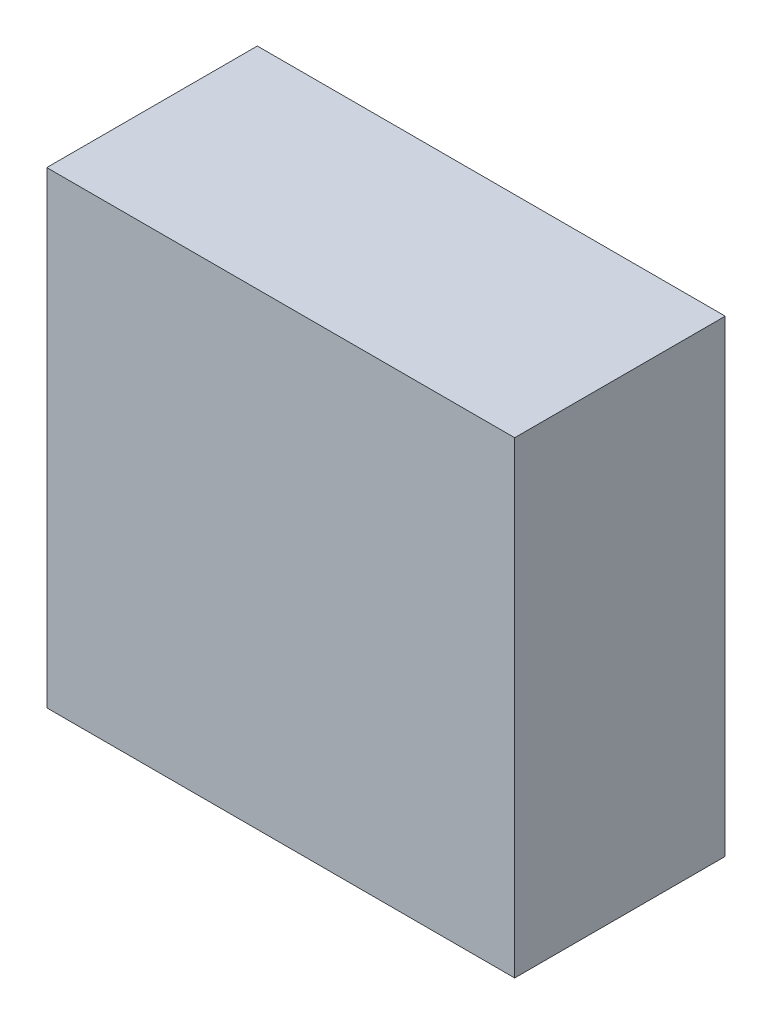
ISO-10303-21;
HEADER;
FILE_DESCRIPTION(('STEP AP214'),'2;1');
FILE_NAME('part.step','',(''),(''),'','','');
FILE_SCHEMA(('AUTOMOTIVE_DESIGN { 1 0 10303 214 1 1 1 1 }'));
ENDSEC;
DATA;
#1=APPLICATION_CONTEXT('core data for automotive mechanical design processes');
#2=APPLICATION_PROTOCOL_DEFINITION('international standard','automotive_design',2000,#1);
#3=PRODUCT_CONTEXT('',#1,'mechanical');
#4=PRODUCT('Part','Part','',(#3));
#5=PRODUCT_RELATED_PRODUCT_CATEGORY('part','',(#4));
#6=PRODUCT_DEFINITION_FORMATION('','',#4);
#7=PRODUCT_DEFINITION_CONTEXT('part definition',#1,'design');
#8=PRODUCT_DEFINITION('design','',#6,#7);
#9=PRODUCT_DEFINITION_SHAPE('','',#8);
#10=(LENGTH_UNIT() NAMED_UNIT(*) SI_UNIT(.MILLI.,.METRE.));
#11=(NAMED_UNIT(*) PLANE_ANGLE_UNIT() SI_UNIT($,.RADIAN.));
#12=(NAMED_UNIT(*) SI_UNIT($,.STERADIAN.) SOLID_ANGLE_UNIT());
#13=UNCERTAINTY_MEASURE_WITH_UNIT(LENGTH_MEASURE(1.E-05),#10,'distance_accuracy_value','');
#14=(GEOMETRIC_REPRESENTATION_CONTEXT(3) GLOBAL_UNCERTAINTY_ASSIGNED_CONTEXT((#13)) GLOBAL_UNIT_ASSIGNED_CONTEXT((#10,
#11,#12)) REPRESENTATION_CONTEXT('',''));
#15=CARTESIAN_POINT('',(0.,0.,0.));
#16=DIRECTION('',(0.,0.,1.));
#17=DIRECTION('',(1.,0.,0.));
#18=AXIS2_PLACEMENT_3D('',#15,#16,#17);
#19=CARTESIAN_POINT('',(1184.5,970.,-1050.));
#20=DIRECTION('',(0.,1.,0.));
#21=DIRECTION('',(1.,0.,0.));
#22=AXIS2_PLACEMENT_3D('',#19,#20,#21);
#23=PLANE('',#22);
#24=DIRECTION('',(0.,0.,1.));
#25=VECTOR('',#24,1.);
#26=CARTESIAN_POINT('',(1124.5,970.,-1050.));
#27=LINE('',#26,#25);
#28=CARTESIAN_POINT('',(1124.5,970.,-1047.));
#29=VERTEX_POINT('',#28);
#30=CARTESIAN_POINT('',(1124.5,970.,-1020.));
#31=VERTEX_POINT('',#30);
#32=EDGE_CURVE('E66',#29,#31,#27,.T.);
#33=ORIENTED_EDGE('',*,*,#32,.F.);
#34=DIRECTION('',(1.,0.,0.));
#35=VECTOR('',#34,1.);
#36=CARTESIAN_POINT('',(1184.5,970.,-1047.));
#37=LINE('',#36,#35);
#38=CARTESIAN_POINT('',(1184.5,970.,-1047.));
#39=VERTEX_POINT('',#38);
#40=EDGE_CURVE('E11',#29,#39,#37,.T.);
#41=ORIENTED_EDGE('',*,*,#40,.T.);
#42=DIRECTION('',(0.,0.,1.));
#43=VECTOR('',#42,1.);
#44=CARTESIAN_POINT('',(1184.5,970.,-1050.));
#45=LINE('',#44,#43);
#46=CARTESIAN_POINT('',(1184.5,970.,-1020.));
#47=VERTEX_POINT('',#46);
#48=EDGE_CURVE('E86',#39,#47,#45,.T.);
#49=ORIENTED_EDGE('',*,*,#48,.T.);
#50=DIRECTION('',(-1.,0.,0.));
#51=VECTOR('',#50,1.);
#52=CARTESIAN_POINT('',(1184.5,970.,-1020.));
#53=LINE('',#52,#51);
#54=EDGE_CURVE('E81',#47,#31,#53,.T.);
#55=ORIENTED_EDGE('',*,*,#54,.T.);
#56=EDGE_LOOP('',(#33,#41,#49,#55));
#57=FACE_BOUND('',#56,.T.);
#58=ADVANCED_FACE('F17',(#57),#23,.F.);
#59=CARTESIAN_POINT('',(1124.5,970.,-1050.));
#60=DIRECTION('',(1.,0.,0.));
#61=DIRECTION('',(0.,-1.,0.));
#62=AXIS2_PLACEMENT_3D('',#59,#60,#61);
#63=PLANE('',#62);
#64=DIRECTION('',(0.,0.,1.));
#65=VECTOR('',#64,1.);
#66=CARTESIAN_POINT('',(1124.5,1030.,-1050.));
#67=LINE('',#66,#65);
#68=CARTESIAN_POINT('',(1124.5,1030.,-1047.));
#69=VERTEX_POINT('',#68);
#70=CARTESIAN_POINT('',(1124.5,1030.,-1020.));
#71=VERTEX_POINT('',#70);
#72=EDGE_CURVE('E75',#69,#71,#67,.T.);
#73=ORIENTED_EDGE('',*,*,#72,.F.);
#74=DIRECTION('',(0.,-1.,0.));
#75=VECTOR('',#74,1.);
#76=CARTESIAN_POINT('',(1124.5,970.,-1047.));
#77=LINE('',#76,#75);
#78=EDGE_CURVE('E24',#69,#29,#77,.T.);
#79=ORIENTED_EDGE('',*,*,#78,.T.);
#80=ORIENTED_EDGE('',*,*,#32,.T.);
#81=DIRECTION('',(0.,1.,0.));
#82=VECTOR('',#81,1.);
#83=CARTESIAN_POINT('',(1124.5,970.,-1020.));
#84=LINE('',#83,#82);
#85=EDGE_CURVE('E69',#31,#71,#84,.T.);
#86=ORIENTED_EDGE('',*,*,#85,.T.);
#87=EDGE_LOOP('',(#73,#79,#80,#86));
#88=FACE_BOUND('',#87,.T.);
#89=ADVANCED_FACE('F68',(#88),#63,.F.);
#90=CARTESIAN_POINT('',(1124.5,1030.,-1050.));
#91=DIRECTION('',(0.,-1.,0.));
#92=DIRECTION('',(-1.,0.,0.));
#93=AXIS2_PLACEMENT_3D('',#90,#91,#92);
#94=PLANE('',#93);
#95=DIRECTION('',(0.,0.,1.));
#96=VECTOR('',#95,1.);
#97=CARTESIAN_POINT('',(1184.5,1030.,-1050.));
#98=LINE('',#97,#96);
#99=CARTESIAN_POINT('',(1184.5,1030.,-1047.));
#100=VERTEX_POINT('',#99);
#101=CARTESIAN_POINT('',(1184.5,1030.,-1020.));
#102=VERTEX_POINT('',#101);
#103=EDGE_CURVE('E98',#100,#102,#98,.T.);
#104=ORIENTED_EDGE('',*,*,#103,.F.);
#105=DIRECTION('',(-1.,0.,0.));
#106=VECTOR('',#105,1.);
#107=CARTESIAN_POINT('',(1124.5,1030.,-1047.));
#108=LINE('',#107,#106);
#109=EDGE_CURVE('E38',#100,#69,#108,.T.);
#110=ORIENTED_EDGE('',*,*,#109,.T.);
#111=ORIENTED_EDGE('',*,*,#72,.T.);
#112=DIRECTION('',(1.,0.,0.));
#113=VECTOR('',#112,1.);
#114=CARTESIAN_POINT('',(1124.5,1030.,-1020.));
#115=LINE('',#114,#113);
#116=EDGE_CURVE('E83',#71,#102,#115,.T.);
#117=ORIENTED_EDGE('',*,*,#116,.T.);
#118=EDGE_LOOP('',(#104,#110,#111,#117));
#119=FACE_BOUND('',#118,.T.);
#120=ADVANCED_FACE('F117',(#119),#94,.F.);
#121=CARTESIAN_POINT('',(1184.5,1030.,-1050.));
#122=DIRECTION('',(-1.,0.,0.));
#123=DIRECTION('',(0.,1.,0.));
#124=AXIS2_PLACEMENT_3D('',#121,#122,#123);
#125=PLANE('',#124);
#126=ORIENTED_EDGE('',*,*,#48,.F.);
#127=DIRECTION('',(0.,1.,0.));
#128=VECTOR('',#127,1.);
#129=CARTESIAN_POINT('',(1184.5,1030.,-1047.));
#130=LINE('',#129,#128);
#131=EDGE_CURVE('E109',#39,#100,#130,.T.);
#132=ORIENTED_EDGE('',*,*,#131,.T.);
#133=ORIENTED_EDGE('',*,*,#103,.T.);
#134=DIRECTION('',(0.,-1.,0.));
#135=VECTOR('',#134,1.);
#136=CARTESIAN_POINT('',(1184.5,1030.,-1020.));
#137=LINE('',#136,#135);
#138=EDGE_CURVE('E95',#102,#47,#137,.T.);
#139=ORIENTED_EDGE('',*,*,#138,.T.);
#140=EDGE_LOOP('',(#126,#132,#133,#139));
#141=FACE_BOUND('',#140,.T.);
#142=ADVANCED_FACE('F114',(#141),#125,.F.);
#143=CARTESIAN_POINT('',(1124.5,970.,-1050.));
#144=DIRECTION('',(0.,0.,-1.));
#145=DIRECTION('',(-1.,0.,0.));
#146=AXIS2_PLACEMENT_3D('',#143,#144,#145);
#147=PLANE('',#146);
#148=DIRECTION('',(1.,0.,0.));
#149=VECTOR('',#148,1.);
#150=CARTESIAN_POINT('',(1184.5,1027.,-1050.));
#151=LINE('',#150,#149);
#152=CARTESIAN_POINT('',(1127.5,1027.,-1050.));
#153=VERTEX_POINT('',#152);
#154=CARTESIAN_POINT('',(1181.5,1027.,-1050.));
#155=VERTEX_POINT('',#154);
#156=EDGE_CURVE('E104',#153,#155,#151,.T.);
#157=ORIENTED_EDGE('',*,*,#156,.T.);
#158=DIRECTION('',(0.,-1.,0.));
#159=VECTOR('',#158,1.);
#160=CARTESIAN_POINT('',(1181.5,970.,-1050.));
#161=LINE('',#160,#159);
#162=CARTESIAN_POINT('',(1181.5,973.,-1050.));
#163=VERTEX_POINT('',#162);
#164=EDGE_CURVE('E106',#155,#163,#161,.T.);
#165=ORIENTED_EDGE('',*,*,#164,.T.);
#166=DIRECTION('',(-1.,0.,0.));
#167=VECTOR('',#166,1.);
#168=CARTESIAN_POINT('',(1124.5,973.,-1050.));
#169=LINE('',#168,#167);
#170=CARTESIAN_POINT('',(1127.5,973.,-1050.));
#171=VERTEX_POINT('',#170);
#172=EDGE_CURVE('E74',#163,#171,#169,.T.);
#173=ORIENTED_EDGE('',*,*,#172,.T.);
#174=DIRECTION('',(0.,1.,0.));
#175=VECTOR('',#174,1.);
#176=CARTESIAN_POINT('',(1127.5,1030.,-1050.));
#177=LINE('',#176,#175);
#178=EDGE_CURVE('E102',#171,#153,#177,.T.);
#179=ORIENTED_EDGE('',*,*,#178,.T.);
#180=EDGE_LOOP('',(#157,#165,#173,#179));
#181=FACE_BOUND('',#180,.T.);
#182=ADVANCED_FACE('F132',(#181),#147,.T.);
#183=CARTESIAN_POINT('',(1124.5,970.,-1020.));
#184=DIRECTION('',(0.,0.,-1.));
#185=DIRECTION('',(-1.,0.,0.));
#186=AXIS2_PLACEMENT_3D('',#183,#184,#185);
#187=PLANE('',#186);
#188=ORIENTED_EDGE('',*,*,#54,.F.);
#189=ORIENTED_EDGE('',*,*,#138,.F.);
#190=ORIENTED_EDGE('',*,*,#116,.F.);
#191=ORIENTED_EDGE('',*,*,#85,.F.);
#192=EDGE_LOOP('',(#188,#189,#190,#191));
#193=FACE_BOUND('',#192,.T.);
#194=ADVANCED_FACE('F79',(#193),#187,.F.);
#195=CARTESIAN_POINT('',(1127.5,970.,-1050.));
#196=DIRECTION('',(-0.707106781186548,0.,-0.707106781186548));
#197=DIRECTION('',(-0.707106781186548,0.,0.707106781186548));
#198=AXIS2_PLACEMENT_3D('',#195,#196,#197);
#199=PLANE('',#198);
#200=DIRECTION('',(0.577350269189619,0.57735026918964,-0.577350269189619));
#201=VECTOR('',#200,1.);
#202=CARTESIAN_POINT('',(1126.5,972.,-1049.));
#203=LINE('',#202,#201);
#204=EDGE_CURVE('E91',#29,#171,#203,.T.);
#205=ORIENTED_EDGE('',*,*,#204,.F.);
#206=ORIENTED_EDGE('',*,*,#78,.F.);
#207=DIRECTION('',(0.577350269189626,-0.577350269189626,-0.577350269189626));
#208=VECTOR('',#207,1.);
#209=CARTESIAN_POINT('',(1146.5,1008.,-1069.));
#210=LINE('',#209,#208);
#211=EDGE_CURVE('E88',#153,#69,#210,.F.);
#212=ORIENTED_EDGE('',*,*,#211,.F.);
#213=ORIENTED_EDGE('',*,*,#178,.F.);
#214=EDGE_LOOP('',(#205,#206,#212,#213));
#215=FACE_BOUND('',#214,.T.);
#216=ADVANCED_FACE('F139',(#215),#199,.T.);
#217=CARTESIAN_POINT('',(1124.5,1027.,-1050.));
#218=DIRECTION('',(0.,0.707106781186548,-0.707106781186548));
#219=DIRECTION('',(0.,0.707106781186548,0.707106781186548));
#220=AXIS2_PLACEMENT_3D('',#217,#218,#219);
#221=PLANE('',#220);
#222=ORIENTED_EDGE('',*,*,#211,.T.);
#223=ORIENTED_EDGE('',*,*,#109,.F.);
#224=DIRECTION('',(-0.577350269189626,-0.577350269189626,-0.577350269189626));
#225=VECTOR('',#224,1.);
#226=CARTESIAN_POINT('',(1162.5,1008.,-1069.));
#227=LINE('',#226,#225);
#228=EDGE_CURVE('E121',#155,#100,#227,.F.);
#229=ORIENTED_EDGE('',*,*,#228,.F.);
#230=ORIENTED_EDGE('',*,*,#156,.F.);
#231=EDGE_LOOP('',(#222,#223,#229,#230));
#232=FACE_BOUND('',#231,.T.);
#233=ADVANCED_FACE('F137',(#232),#221,.T.);
#234=CARTESIAN_POINT('',(1124.5,973.,-1050.));
#235=DIRECTION('',(0.,-0.707106781186535,-0.707106781186561));
#236=DIRECTION('',(0.,0.707106781186561,-0.707106781186535));
#237=AXIS2_PLACEMENT_3D('',#234,#235,#236);
#238=PLANE('',#237);
#239=ORIENTED_EDGE('',*,*,#204,.T.);
#240=ORIENTED_EDGE('',*,*,#172,.F.);
#241=DIRECTION('',(0.577350269189619,-0.57735026918964,0.577350269189619));
#242=VECTOR('',#241,1.);
#243=CARTESIAN_POINT('',(1162.5,992.,-1069.));
#244=LINE('',#243,#242);
#245=EDGE_CURVE('E123',#39,#163,#244,.F.);
#246=ORIENTED_EDGE('',*,*,#245,.F.);
#247=ORIENTED_EDGE('',*,*,#40,.F.);
#248=EDGE_LOOP('',(#239,#240,#246,#247));
#249=FACE_BOUND('',#248,.T.);
#250=ADVANCED_FACE('F129',(#249),#238,.T.);
#251=CARTESIAN_POINT('',(1181.5,970.,-1050.));
#252=DIRECTION('',(0.707106781186548,0.,-0.707106781186548));
#253=DIRECTION('',(-0.707106781186548,0.,-0.707106781186548));
#254=AXIS2_PLACEMENT_3D('',#251,#252,#253);
#255=PLANE('',#254);
#256=ORIENTED_EDGE('',*,*,#228,.T.);
#257=ORIENTED_EDGE('',*,*,#131,.F.);
#258=ORIENTED_EDGE('',*,*,#245,.T.);
#259=ORIENTED_EDGE('',*,*,#164,.F.);
#260=EDGE_LOOP('',(#256,#257,#258,#259));
#261=FACE_BOUND('',#260,.T.);
#262=ADVANCED_FACE('F126',(#261),#255,.T.);
#263=CLOSED_SHELL('',(#58,#89,#120,#142,#182,#194,#216,#233,#250,#262));
#264=MANIFOLD_SOLID_BREP('B1',#263);
#265=ADVANCED_BREP_SHAPE_REPRESENTATION('',(#18,#264),#14);
#266=SHAPE_DEFINITION_REPRESENTATION(#9,#265);
ENDSEC;
END-ISO-10303-21;
